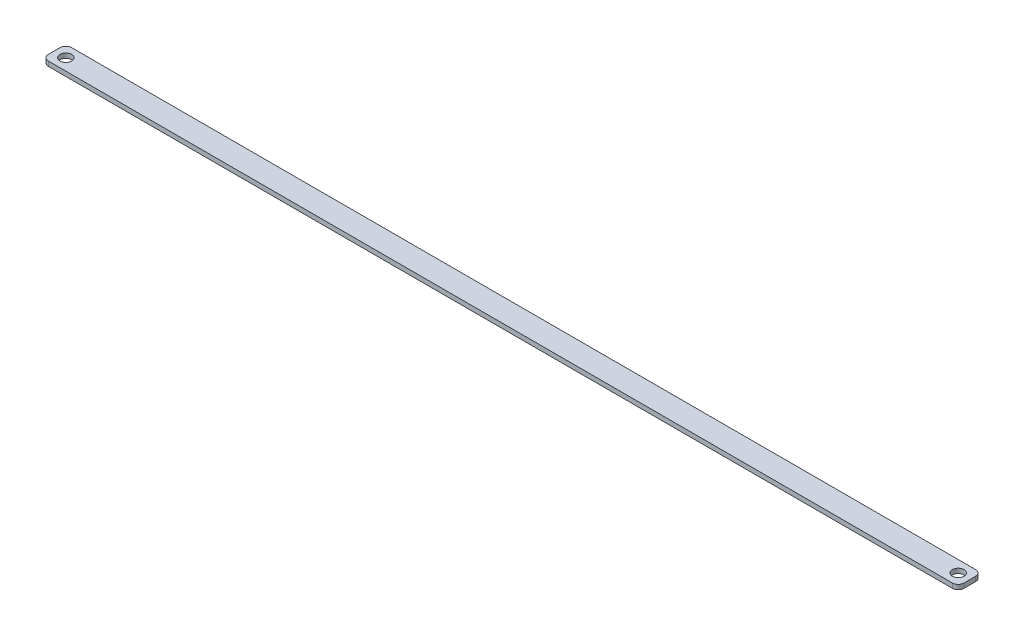
ISO-10303-21;
HEADER;
FILE_DESCRIPTION(('STEP AP214'),'2;1');
FILE_NAME('part.step','',(''),(''),'','','');
FILE_SCHEMA(('AUTOMOTIVE_DESIGN { 1 0 10303 214 1 1 1 1 }'));
ENDSEC;
DATA;
#1=APPLICATION_CONTEXT('core data for automotive mechanical design processes');
#2=APPLICATION_PROTOCOL_DEFINITION('international standard','automotive_design',2000,#1);
#3=PRODUCT_CONTEXT('',#1,'mechanical');
#4=PRODUCT('Part','Part','',(#3));
#5=PRODUCT_RELATED_PRODUCT_CATEGORY('part','',(#4));
#6=PRODUCT_DEFINITION_FORMATION('','',#4);
#7=PRODUCT_DEFINITION_CONTEXT('part definition',#1,'design');
#8=PRODUCT_DEFINITION('design','',#6,#7);
#9=PRODUCT_DEFINITION_SHAPE('','',#8);
#10=(LENGTH_UNIT() NAMED_UNIT(*) SI_UNIT(.MILLI.,.METRE.));
#11=(NAMED_UNIT(*) PLANE_ANGLE_UNIT() SI_UNIT($,.RADIAN.));
#12=(NAMED_UNIT(*) SI_UNIT($,.STERADIAN.) SOLID_ANGLE_UNIT());
#13=UNCERTAINTY_MEASURE_WITH_UNIT(LENGTH_MEASURE(1.E-05),#10,'distance_accuracy_value','');
#14=(GEOMETRIC_REPRESENTATION_CONTEXT(3) GLOBAL_UNCERTAINTY_ASSIGNED_CONTEXT((#13)) GLOBAL_UNIT_ASSIGNED_CONTEXT((#10,
#11,#12)) REPRESENTATION_CONTEXT('',''));
#15=CARTESIAN_POINT('',(0.,0.,0.));
#16=DIRECTION('',(0.,0.,1.));
#17=DIRECTION('',(1.,0.,0.));
#18=AXIS2_PLACEMENT_3D('',#15,#16,#17);
#19=CARTESIAN_POINT('',(221.153763306942,2.,-5.));
#20=DIRECTION('',(0.,-1.,0.));
#21=DIRECTION('',(0.,0.,-1.));
#22=AXIS2_PLACEMENT_3D('',#19,#20,#21);
#23=CYLINDRICAL_SURFACE('',#22,2.5);
#24=CARTESIAN_POINT('',(221.153763306942,0.,-5.));
#25=DIRECTION('',(0.,1.,0.));
#26=DIRECTION('',(0.,0.,1.));
#27=AXIS2_PLACEMENT_3D('',#24,#25,#26);
#28=CIRCLE('',#27,2.5);
#29=CARTESIAN_POINT('',(221.153763306942,0.,-2.5));
#30=VERTEX_POINT('',#29);
#31=EDGE_CURVE('E220',#30,#30,#28,.T.);
#32=ORIENTED_EDGE('',*,*,#31,.F.);
#33=EDGE_LOOP('',(#32));
#34=FACE_BOUND('',#33,.T.);
#35=CARTESIAN_POINT('',(221.153763306942,2.,-5.));
#36=DIRECTION('',(0.,1.,0.));
#37=DIRECTION('',(0.,0.,1.));
#38=AXIS2_PLACEMENT_3D('',#35,#36,#37);
#39=CIRCLE('',#38,2.5);
#40=CARTESIAN_POINT('',(221.153763306942,2.,-2.5));
#41=VERTEX_POINT('',#40);
#42=EDGE_CURVE('E13',#41,#41,#39,.T.);
#43=ORIENTED_EDGE('',*,*,#42,.T.);
#44=EDGE_LOOP('',(#43));
#45=FACE_BOUND('',#44,.T.);
#46=ADVANCED_FACE('F93',(#34,#45),#23,.F.);
#47=CARTESIAN_POINT('',(-162.846236693058,2.,-5.));
#48=DIRECTION('',(0.,-1.,0.));
#49=DIRECTION('',(0.,0.,-1.));
#50=AXIS2_PLACEMENT_3D('',#47,#48,#49);
#51=CYLINDRICAL_SURFACE('',#50,2.5);
#52=CARTESIAN_POINT('',(-162.846236693058,0.,-5.));
#53=DIRECTION('',(0.,1.,0.));
#54=DIRECTION('',(0.,0.,1.));
#55=AXIS2_PLACEMENT_3D('',#52,#53,#54);
#56=CIRCLE('',#55,2.5);
#57=CARTESIAN_POINT('',(-162.846236693058,0.,-2.5));
#58=VERTEX_POINT('',#57);
#59=EDGE_CURVE('E233',#58,#58,#56,.T.);
#60=ORIENTED_EDGE('',*,*,#59,.F.);
#61=EDGE_LOOP('',(#60));
#62=FACE_BOUND('',#61,.T.);
#63=CARTESIAN_POINT('',(-162.846236693058,2.,-5.));
#64=DIRECTION('',(0.,1.,0.));
#65=DIRECTION('',(0.,0.,1.));
#66=AXIS2_PLACEMENT_3D('',#63,#64,#65);
#67=CIRCLE('',#66,2.5);
#68=CARTESIAN_POINT('',(-162.846236693058,2.,-2.5));
#69=VERTEX_POINT('',#68);
#70=EDGE_CURVE('E103',#69,#69,#67,.T.);
#71=ORIENTED_EDGE('',*,*,#70,.T.);
#72=EDGE_LOOP('',(#71));
#73=FACE_BOUND('',#72,.T.);
#74=ADVANCED_FACE('F254',(#62,#73),#51,.F.);
#75=CARTESIAN_POINT('',(47.5,2.,-2.5));
#76=DIRECTION('',(0.,1.,0.));
#77=DIRECTION('',(0.,0.,1.));
#78=AXIS2_PLACEMENT_3D('',#75,#76,#77);
#79=PLANE('',#78);
#80=DIRECTION('',(1.,0.,0.));
#81=VECTOR('',#80,1.);
#82=CARTESIAN_POINT('',(-165.346236693058,2.,0.));
#83=LINE('',#82,#81);
#84=CARTESIAN_POINT('',(-165.346236693058,2.,0.));
#85=VERTEX_POINT('',#84);
#86=CARTESIAN_POINT('',(223.653763306942,2.,0.));
#87=VERTEX_POINT('',#86);
#88=EDGE_CURVE('E156',#85,#87,#83,.T.);
#89=ORIENTED_EDGE('',*,*,#88,.T.);
#90=CARTESIAN_POINT('',(223.653763306942,2.,-2.5));
#91=DIRECTION('',(0.,1.,0.));
#92=DIRECTION('',(0.,0.,1.));
#93=AXIS2_PLACEMENT_3D('',#90,#91,#92);
#94=CIRCLE('',#93,2.5);
#95=CARTESIAN_POINT('',(226.153763306942,2.,-2.50000000000002));
#96=VERTEX_POINT('',#95);
#97=EDGE_CURVE('E162',#87,#96,#94,.T.);
#98=ORIENTED_EDGE('',*,*,#97,.T.);
#99=DIRECTION('',(0.,0.,-1.));
#100=VECTOR('',#99,1.);
#101=CARTESIAN_POINT('',(226.153763306942,2.,-2.50000000000002));
#102=LINE('',#101,#100);
#103=CARTESIAN_POINT('',(226.153763306942,2.,-7.49999999999998));
#104=VERTEX_POINT('',#103);
#105=EDGE_CURVE('E184',#96,#104,#102,.T.);
#106=ORIENTED_EDGE('',*,*,#105,.T.);
#107=CARTESIAN_POINT('',(223.653763306942,2.,-7.5));
#108=DIRECTION('',(0.,1.,0.));
#109=DIRECTION('',(0.,0.,-1.));
#110=AXIS2_PLACEMENT_3D('',#107,#108,#109);
#111=CIRCLE('',#110,2.5);
#112=CARTESIAN_POINT('',(223.653763306942,2.,-10.));
#113=VERTEX_POINT('',#112);
#114=EDGE_CURVE('E188',#104,#113,#111,.T.);
#115=ORIENTED_EDGE('',*,*,#114,.T.);
#116=DIRECTION('',(-1.,0.,0.));
#117=VECTOR('',#116,1.);
#118=CARTESIAN_POINT('',(178.653763306942,2.,-10.));
#119=LINE('',#118,#117);
#120=CARTESIAN_POINT('',(-165.346236693058,2.,-10.));
#121=VERTEX_POINT('',#120);
#122=EDGE_CURVE('E242',#113,#121,#119,.T.);
#123=ORIENTED_EDGE('',*,*,#122,.T.);
#124=CARTESIAN_POINT('',(-165.346236693058,2.,-7.5));
#125=DIRECTION('',(0.,1.,0.));
#126=DIRECTION('',(0.,0.,-1.));
#127=AXIS2_PLACEMENT_3D('',#124,#125,#126);
#128=CIRCLE('',#127,2.5);
#129=CARTESIAN_POINT('',(-167.846236693058,2.,-7.49999999999998));
#130=VERTEX_POINT('',#129);
#131=EDGE_CURVE('E168',#121,#130,#128,.T.);
#132=ORIENTED_EDGE('',*,*,#131,.T.);
#133=DIRECTION('',(0.,0.,1.));
#134=VECTOR('',#133,1.);
#135=CARTESIAN_POINT('',(-167.846236693058,2.,-2.50000000000002));
#136=LINE('',#135,#134);
#137=CARTESIAN_POINT('',(-167.846236693058,2.,-2.50000000000002));
#138=VERTEX_POINT('',#137);
#139=EDGE_CURVE('E186',#130,#138,#136,.T.);
#140=ORIENTED_EDGE('',*,*,#139,.T.);
#141=CARTESIAN_POINT('',(-165.346236693058,2.,-2.5));
#142=DIRECTION('',(0.,1.,0.));
#143=DIRECTION('',(0.,0.,-1.));
#144=AXIS2_PLACEMENT_3D('',#141,#142,#143);
#145=CIRCLE('',#144,2.5);
#146=EDGE_CURVE('E165',#138,#85,#145,.T.);
#147=ORIENTED_EDGE('',*,*,#146,.T.);
#148=EDGE_LOOP('',(#89,#98,#106,#115,#123,#132,#140,#147));
#149=FACE_BOUND('',#148,.T.);
#150=ORIENTED_EDGE('',*,*,#42,.F.);
#151=EDGE_LOOP('',(#150));
#152=FACE_BOUND('',#151,.T.);
#153=ORIENTED_EDGE('',*,*,#70,.F.);
#154=EDGE_LOOP('',(#153));
#155=FACE_BOUND('',#154,.T.);
#156=ADVANCED_FACE('F158',(#149,#152,#155),#79,.T.);
#157=CARTESIAN_POINT('',(223.653763306942,0.,-2.5));
#158=DIRECTION('',(0.,1.,0.));
#159=DIRECTION('',(0.,0.,1.));
#160=AXIS2_PLACEMENT_3D('',#157,#158,#159);
#161=PLANE('',#160);
#162=ORIENTED_EDGE('',*,*,#31,.T.);
#163=EDGE_LOOP('',(#162));
#164=FACE_BOUND('',#163,.T.);
#165=CARTESIAN_POINT('',(223.653763306942,0.,-2.5));
#166=DIRECTION('',(0.,1.,0.));
#167=DIRECTION('',(0.,0.,1.));
#168=AXIS2_PLACEMENT_3D('',#165,#166,#167);
#169=CIRCLE('',#168,2.5);
#170=CARTESIAN_POINT('',(223.653763306942,0.,0.));
#171=VERTEX_POINT('',#170);
#172=CARTESIAN_POINT('',(226.153763306942,0.,-2.50000000000002));
#173=VERTEX_POINT('',#172);
#174=EDGE_CURVE('E177',#171,#173,#169,.T.);
#175=ORIENTED_EDGE('',*,*,#174,.F.);
#176=DIRECTION('',(1.,0.,0.));
#177=VECTOR('',#176,1.);
#178=CARTESIAN_POINT('',(-165.346236693058,0.,0.));
#179=LINE('',#178,#177);
#180=CARTESIAN_POINT('',(-165.346236693058,0.,0.));
#181=VERTEX_POINT('',#180);
#182=EDGE_CURVE('E173',#181,#171,#179,.T.);
#183=ORIENTED_EDGE('',*,*,#182,.F.);
#184=CARTESIAN_POINT('',(-165.346236693058,0.,-2.5));
#185=DIRECTION('',(0.,1.,0.));
#186=DIRECTION('',(0.,0.,-1.));
#187=AXIS2_PLACEMENT_3D('',#184,#185,#186);
#188=CIRCLE('',#187,2.5);
#189=CARTESIAN_POINT('',(-167.846236693058,0.,-2.50000000000002));
#190=VERTEX_POINT('',#189);
#191=EDGE_CURVE('E199',#190,#181,#188,.T.);
#192=ORIENTED_EDGE('',*,*,#191,.F.);
#193=DIRECTION('',(0.,0.,1.));
#194=VECTOR('',#193,1.);
#195=CARTESIAN_POINT('',(-167.846236693058,0.,-2.50000000000002));
#196=LINE('',#195,#194);
#197=CARTESIAN_POINT('',(-167.846236693058,0.,-7.49999999999998));
#198=VERTEX_POINT('',#197);
#199=EDGE_CURVE('E206',#198,#190,#196,.T.);
#200=ORIENTED_EDGE('',*,*,#199,.F.);
#201=CARTESIAN_POINT('',(-165.346236693058,0.,-7.5));
#202=DIRECTION('',(0.,1.,0.));
#203=DIRECTION('',(0.,0.,-1.));
#204=AXIS2_PLACEMENT_3D('',#201,#202,#203);
#205=CIRCLE('',#204,2.5);
#206=CARTESIAN_POINT('',(-165.346236693058,0.,-10.));
#207=VERTEX_POINT('',#206);
#208=EDGE_CURVE('E212',#207,#198,#205,.T.);
#209=ORIENTED_EDGE('',*,*,#208,.F.);
#210=DIRECTION('',(-1.,0.,0.));
#211=VECTOR('',#210,1.);
#212=CARTESIAN_POINT('',(178.653763306942,0.,-10.));
#213=LINE('',#212,#211);
#214=CARTESIAN_POINT('',(223.653763306942,0.,-10.));
#215=VERTEX_POINT('',#214);
#216=EDGE_CURVE('E218',#215,#207,#213,.T.);
#217=ORIENTED_EDGE('',*,*,#216,.F.);
#218=CARTESIAN_POINT('',(223.653763306942,0.,-7.5));
#219=DIRECTION('',(0.,1.,0.));
#220=DIRECTION('',(0.,0.,-1.));
#221=AXIS2_PLACEMENT_3D('',#218,#219,#220);
#222=CIRCLE('',#221,2.5);
#223=CARTESIAN_POINT('',(226.153763306942,0.,-7.49999999999998));
#224=VERTEX_POINT('',#223);
#225=EDGE_CURVE('E223',#224,#215,#222,.T.);
#226=ORIENTED_EDGE('',*,*,#225,.F.);
#227=DIRECTION('',(0.,0.,-1.));
#228=VECTOR('',#227,1.);
#229=CARTESIAN_POINT('',(226.153763306942,0.,-2.50000000000002));
#230=LINE('',#229,#228);
#231=EDGE_CURVE('E178',#173,#224,#230,.T.);
#232=ORIENTED_EDGE('',*,*,#231,.F.);
#233=EDGE_LOOP('',(#175,#183,#192,#200,#209,#217,#226,#232));
#234=FACE_BOUND('',#233,.T.);
#235=ORIENTED_EDGE('',*,*,#59,.T.);
#236=EDGE_LOOP('',(#235));
#237=FACE_BOUND('',#236,.T.);
#238=ADVANCED_FACE('F249',(#164,#234,#237),#161,.F.);
#239=CARTESIAN_POINT('',(178.653763306942,2.,-10.));
#240=DIRECTION('',(0.,0.,1.));
#241=DIRECTION('',(1.,0.,0.));
#242=AXIS2_PLACEMENT_3D('',#239,#240,#241);
#243=PLANE('',#242);
#244=ORIENTED_EDGE('',*,*,#216,.T.);
#245=DIRECTION('',(0.,-1.,0.));
#246=VECTOR('',#245,1.);
#247=CARTESIAN_POINT('',(-165.346236693058,2.,-10.));
#248=LINE('',#247,#246);
#249=EDGE_CURVE('E209',#121,#207,#248,.T.);
#250=ORIENTED_EDGE('',*,*,#249,.F.);
#251=ORIENTED_EDGE('',*,*,#122,.F.);
#252=DIRECTION('',(0.,-1.,0.));
#253=VECTOR('',#252,1.);
#254=CARTESIAN_POINT('',(223.653763306942,2.,-10.));
#255=LINE('',#254,#253);
#256=EDGE_CURVE('E112',#113,#215,#255,.T.);
#257=ORIENTED_EDGE('',*,*,#256,.T.);
#258=EDGE_LOOP('',(#244,#250,#251,#257));
#259=FACE_BOUND('',#258,.T.);
#260=ADVANCED_FACE('F271',(#259),#243,.F.);
#261=CARTESIAN_POINT('',(178.653763306942,2.,0.));
#262=DIRECTION('',(0.,0.,-1.));
#263=DIRECTION('',(-1.,0.,0.));
#264=AXIS2_PLACEMENT_3D('',#261,#262,#263);
#265=PLANE('',#264);
#266=DIRECTION('',(0.,-1.,0.));
#267=VECTOR('',#266,1.);
#268=CARTESIAN_POINT('',(223.653763306942,2.,0.));
#269=LINE('',#268,#267);
#270=EDGE_CURVE('E171',#87,#171,#269,.T.);
#271=ORIENTED_EDGE('',*,*,#270,.F.);
#272=ORIENTED_EDGE('',*,*,#88,.F.);
#273=DIRECTION('',(0.,-1.,0.));
#274=VECTOR('',#273,1.);
#275=CARTESIAN_POINT('',(-165.346236693058,2.,0.));
#276=LINE('',#275,#274);
#277=EDGE_CURVE('E196',#85,#181,#276,.T.);
#278=ORIENTED_EDGE('',*,*,#277,.T.);
#279=ORIENTED_EDGE('',*,*,#182,.T.);
#280=EDGE_LOOP('',(#271,#272,#278,#279));
#281=FACE_BOUND('',#280,.T.);
#282=ADVANCED_FACE('F172',(#281),#265,.F.);
#283=CARTESIAN_POINT('',(223.653763306942,2.,-2.5));
#284=DIRECTION('',(0.,-1.,0.));
#285=DIRECTION('',(0.,0.,-1.));
#286=AXIS2_PLACEMENT_3D('',#283,#284,#285);
#287=CYLINDRICAL_SURFACE('',#286,2.5);
#288=ORIENTED_EDGE('',*,*,#174,.T.);
#289=DIRECTION('',(0.,-1.,0.));
#290=VECTOR('',#289,1.);
#291=CARTESIAN_POINT('',(226.153763306942,2.,-2.50000000000002));
#292=LINE('',#291,#290);
#293=EDGE_CURVE('E182',#96,#173,#292,.T.);
#294=ORIENTED_EDGE('',*,*,#293,.F.);
#295=ORIENTED_EDGE('',*,*,#97,.F.);
#296=ORIENTED_EDGE('',*,*,#270,.T.);
#297=EDGE_LOOP('',(#288,#294,#295,#296));
#298=FACE_BOUND('',#297,.T.);
#299=ADVANCED_FACE('F180',(#298),#287,.T.);
#300=CARTESIAN_POINT('',(226.153763306942,2.,-2.50000000000002));
#301=DIRECTION('',(-1.,0.,0.));
#302=DIRECTION('',(0.,0.,1.));
#303=AXIS2_PLACEMENT_3D('',#300,#301,#302);
#304=PLANE('',#303);
#305=ORIENTED_EDGE('',*,*,#231,.T.);
#306=DIRECTION('',(0.,-1.,0.));
#307=VECTOR('',#306,1.);
#308=CARTESIAN_POINT('',(226.153763306942,2.,-7.49999999999998));
#309=LINE('',#308,#307);
#310=EDGE_CURVE('E215',#104,#224,#309,.T.);
#311=ORIENTED_EDGE('',*,*,#310,.F.);
#312=ORIENTED_EDGE('',*,*,#105,.F.);
#313=ORIENTED_EDGE('',*,*,#293,.T.);
#314=EDGE_LOOP('',(#305,#311,#312,#313));
#315=FACE_BOUND('',#314,.T.);
#316=ADVANCED_FACE('F278',(#315),#304,.F.);
#317=CARTESIAN_POINT('',(223.653763306942,2.,-7.5));
#318=DIRECTION('',(0.,-1.,0.));
#319=DIRECTION('',(0.,0.,-1.));
#320=AXIS2_PLACEMENT_3D('',#317,#318,#319);
#321=CYLINDRICAL_SURFACE('',#320,2.5);
#322=ORIENTED_EDGE('',*,*,#225,.T.);
#323=ORIENTED_EDGE('',*,*,#256,.F.);
#324=ORIENTED_EDGE('',*,*,#114,.F.);
#325=ORIENTED_EDGE('',*,*,#310,.T.);
#326=EDGE_LOOP('',(#322,#323,#324,#325));
#327=FACE_BOUND('',#326,.T.);
#328=ADVANCED_FACE('F281',(#327),#321,.T.);
#329=CARTESIAN_POINT('',(-165.346236693058,2.,-7.5));
#330=DIRECTION('',(0.,-1.,0.));
#331=DIRECTION('',(0.,0.,-1.));
#332=AXIS2_PLACEMENT_3D('',#329,#330,#331);
#333=CYLINDRICAL_SURFACE('',#332,2.5);
#334=ORIENTED_EDGE('',*,*,#208,.T.);
#335=DIRECTION('',(0.,-1.,0.));
#336=VECTOR('',#335,1.);
#337=CARTESIAN_POINT('',(-167.846236693058,2.,-7.49999999999998));
#338=LINE('',#337,#336);
#339=EDGE_CURVE('E202',#130,#198,#338,.T.);
#340=ORIENTED_EDGE('',*,*,#339,.F.);
#341=ORIENTED_EDGE('',*,*,#131,.F.);
#342=ORIENTED_EDGE('',*,*,#249,.T.);
#343=EDGE_LOOP('',(#334,#340,#341,#342));
#344=FACE_BOUND('',#343,.T.);
#345=ADVANCED_FACE('F285',(#344),#333,.T.);
#346=CARTESIAN_POINT('',(-167.846236693058,2.,-2.50000000000002));
#347=DIRECTION('',(1.,0.,0.));
#348=DIRECTION('',(0.,0.,-1.));
#349=AXIS2_PLACEMENT_3D('',#346,#347,#348);
#350=PLANE('',#349);
#351=ORIENTED_EDGE('',*,*,#199,.T.);
#352=DIRECTION('',(0.,-1.,0.));
#353=VECTOR('',#352,1.);
#354=CARTESIAN_POINT('',(-167.846236693058,2.,-2.50000000000002));
#355=LINE('',#354,#353);
#356=EDGE_CURVE('E203',#138,#190,#355,.T.);
#357=ORIENTED_EDGE('',*,*,#356,.F.);
#358=ORIENTED_EDGE('',*,*,#139,.F.);
#359=ORIENTED_EDGE('',*,*,#339,.T.);
#360=EDGE_LOOP('',(#351,#357,#358,#359));
#361=FACE_BOUND('',#360,.T.);
#362=ADVANCED_FACE('F288',(#361),#350,.F.);
#363=CARTESIAN_POINT('',(-165.346236693058,2.,-2.5));
#364=DIRECTION('',(0.,-1.,0.));
#365=DIRECTION('',(0.,0.,-1.));
#366=AXIS2_PLACEMENT_3D('',#363,#364,#365);
#367=CYLINDRICAL_SURFACE('',#366,2.5);
#368=ORIENTED_EDGE('',*,*,#191,.T.);
#369=ORIENTED_EDGE('',*,*,#277,.F.);
#370=ORIENTED_EDGE('',*,*,#146,.F.);
#371=ORIENTED_EDGE('',*,*,#356,.T.);
#372=EDGE_LOOP('',(#368,#369,#370,#371));
#373=FACE_BOUND('',#372,.T.);
#374=ADVANCED_FACE('F95',(#373),#367,.T.);
#375=CLOSED_SHELL('',(#46,#74,#156,#238,#260,#282,#299,#316,#328,#345,#362,#374));
#376=MANIFOLD_SOLID_BREP('B2',#375);
#377=ADVANCED_BREP_SHAPE_REPRESENTATION('',(#18,#376),#14);
#378=SHAPE_DEFINITION_REPRESENTATION(#9,#377);
ENDSEC;
END-ISO-10303-21;
